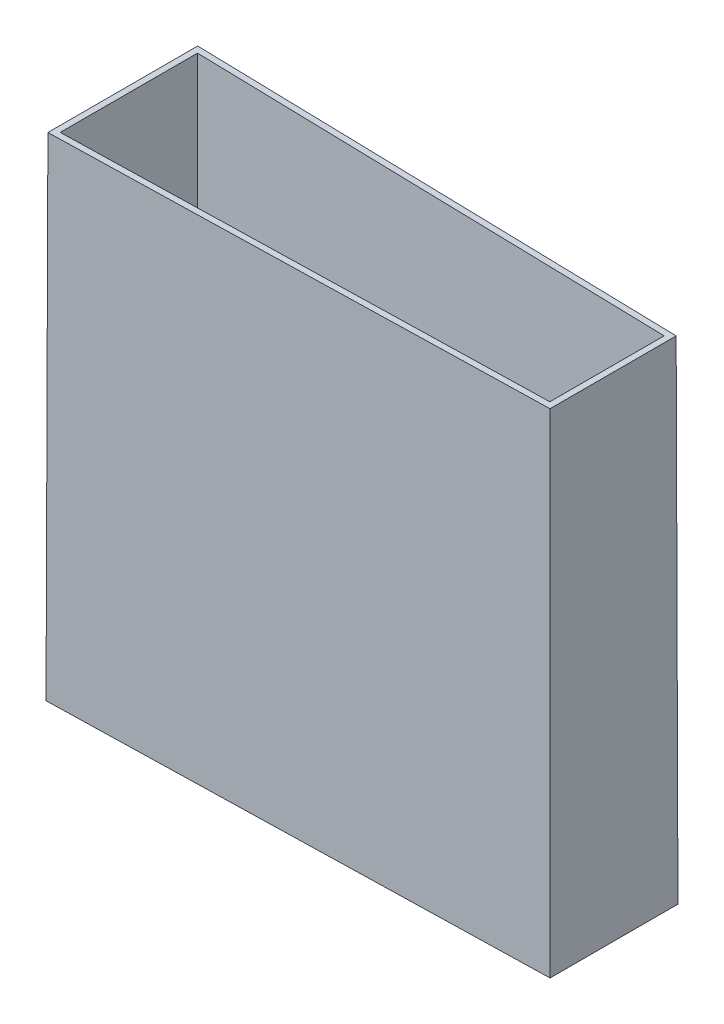
ISO-10303-21;
HEADER;
FILE_DESCRIPTION(('STEP AP214'),'2;1');
FILE_NAME('part.step','',(''),(''),'','','');
FILE_SCHEMA(('AUTOMOTIVE_DESIGN { 1 0 10303 214 1 1 1 1 }'));
ENDSEC;
DATA;
#1=APPLICATION_CONTEXT('core data for automotive mechanical design processes');
#2=APPLICATION_PROTOCOL_DEFINITION('international standard','automotive_design',2000,#1);
#3=PRODUCT_CONTEXT('',#1,'mechanical');
#4=PRODUCT('Part','Part','',(#3));
#5=PRODUCT_RELATED_PRODUCT_CATEGORY('part','',(#4));
#6=PRODUCT_DEFINITION_FORMATION('','',#4);
#7=PRODUCT_DEFINITION_CONTEXT('part definition',#1,'design');
#8=PRODUCT_DEFINITION('design','',#6,#7);
#9=PRODUCT_DEFINITION_SHAPE('','',#8);
#10=(LENGTH_UNIT() NAMED_UNIT(*) SI_UNIT(.MILLI.,.METRE.));
#11=(NAMED_UNIT(*) PLANE_ANGLE_UNIT() SI_UNIT($,.RADIAN.));
#12=(NAMED_UNIT(*) SI_UNIT($,.STERADIAN.) SOLID_ANGLE_UNIT());
#13=UNCERTAINTY_MEASURE_WITH_UNIT(LENGTH_MEASURE(1.E-05),#10,'distance_accuracy_value','');
#14=(GEOMETRIC_REPRESENTATION_CONTEXT(3) GLOBAL_UNCERTAINTY_ASSIGNED_CONTEXT((#13)) GLOBAL_UNIT_ASSIGNED_CONTEXT((#10,
#11,#12)) REPRESENTATION_CONTEXT('',''));
#15=CARTESIAN_POINT('',(0.,0.,0.));
#16=DIRECTION('',(0.,0.,1.));
#17=DIRECTION('',(1.,0.,0.));
#18=AXIS2_PLACEMENT_3D('',#15,#16,#17);
#19=CARTESIAN_POINT('',(0.,80.8,0.));
#20=DIRECTION('',(0.,1.,0.));
#21=DIRECTION('',(0.,0.,1.));
#22=AXIS2_PLACEMENT_3D('',#19,#20,#21);
#23=PLANE('',#22);
#24=DIRECTION('',(0.99970786139218,0.,-0.0241700614536627));
#25=VECTOR('',#24,1.);
#26=CARTESIAN_POINT('',(-7.4983383967968,80.8,14.0997284287893));
#27=LINE('',#26,#25);
#28=CARTESIAN_POINT('',(-7.4983383967968,80.8,14.0997284287893));
#29=VERTEX_POINT('',#28);
#30=CARTESIAN_POINT('',(73.0016616032032,80.8,12.1534699045137));
#31=VERTEX_POINT('',#30);
#32=EDGE_CURVE('E284',#29,#31,#27,.T.);
#33=ORIENTED_EDGE('',*,*,#32,.T.);
#34=DIRECTION('',(0.,0.,-1.));
#35=VECTOR('',#34,1.);
#36=CARTESIAN_POINT('',(73.0016616032032,80.8,12.1534699045137));
#37=LINE('',#36,#35);
#38=CARTESIAN_POINT('',(73.0016616032032,80.8,-8.55368284187437));
#39=VERTEX_POINT('',#38);
#40=EDGE_CURVE('E282',#31,#39,#37,.T.);
#41=ORIENTED_EDGE('',*,*,#40,.T.);
#42=DIRECTION('',(-0.999709957314757,0.,-0.0240832150205744));
#43=VECTOR('',#42,1.);
#44=CARTESIAN_POINT('',(73.0016616032032,80.8,-8.55368284187437));
#45=LINE('',#44,#43);
#46=CARTESIAN_POINT('',(-7.4983383967968,80.8,-10.492944119579));
#47=VERTEX_POINT('',#46);
#48=EDGE_CURVE('E58',#39,#47,#45,.T.);
#49=ORIENTED_EDGE('',*,*,#48,.T.);
#50=DIRECTION('',(0.,0.,1.));
#51=VECTOR('',#50,1.);
#52=CARTESIAN_POINT('',(-7.4983383967968,80.8,-10.492944119579));
#53=LINE('',#52,#51);
#54=EDGE_CURVE('E12',#47,#29,#53,.T.);
#55=ORIENTED_EDGE('',*,*,#54,.T.);
#56=EDGE_LOOP('',(#33,#41,#49,#55));
#57=FACE_BOUND('',#56,.T.);
#58=DIRECTION('',(0.,0.,1.));
#59=VECTOR('',#58,1.);
#60=CARTESIAN_POINT('',(-6.4983383967968,80.8,-9.46856379053706));
#61=LINE('',#60,#59);
#62=CARTESIAN_POINT('',(-6.4983383967968,80.8,-9.46856379053706));
#63=VERTEX_POINT('',#62);
#64=CARTESIAN_POINT('',(-6.4983383967968,80.8,13.0752590802864));
#65=VERTEX_POINT('',#64);
#66=EDGE_CURVE('E264',#63,#65,#61,.T.);
#67=ORIENTED_EDGE('',*,*,#66,.F.);
#68=DIRECTION('',(-0.999709957314757,0.,-0.0240832150205743));
#69=VECTOR('',#68,1.);
#70=CARTESIAN_POINT('',(72.0016616032032,80.8,-7.57748291724747));
#71=LINE('',#70,#69);
#72=CARTESIAN_POINT('',(72.0016616032032,80.8,-7.57748291724747));
#73=VERTEX_POINT('',#72);
#74=EDGE_CURVE('E382',#73,#63,#71,.T.);
#75=ORIENTED_EDGE('',*,*,#74,.F.);
#76=DIRECTION('',(0.,0.,-1.));
#77=VECTOR('',#76,1.);
#78=CARTESIAN_POINT('',(72.0016616032032,80.8,11.1773548050611));
#79=LINE('',#78,#77);
#80=CARTESIAN_POINT('',(72.0016616032032,80.8,11.1773548050611));
#81=VERTEX_POINT('',#80);
#82=EDGE_CURVE('E125',#81,#73,#79,.T.);
#83=ORIENTED_EDGE('',*,*,#82,.F.);
#84=DIRECTION('',(0.99970786139218,0.,-0.0241700614536627));
#85=VECTOR('',#84,1.);
#86=CARTESIAN_POINT('',(-6.4983383967968,80.8,13.0752590802864));
#87=LINE('',#86,#85);
#88=EDGE_CURVE('E185',#65,#81,#87,.T.);
#89=ORIENTED_EDGE('',*,*,#88,.F.);
#90=EDGE_LOOP('',(#67,#75,#83,#89));
#91=FACE_BOUND('',#90,.T.);
#92=ADVANCED_FACE('F49',(#57,#91),#23,.T.);
#93=CARTESIAN_POINT('',(0.,0.,0.));
#94=DIRECTION('',(0.,1.,0.));
#95=DIRECTION('',(0.,0.,1.));
#96=AXIS2_PLACEMENT_3D('',#93,#94,#95);
#97=PLANE('',#96);
#98=DIRECTION('',(-0.999709957314757,0.,-0.0240832150205743));
#99=VECTOR('',#98,1.);
#100=CARTESIAN_POINT('',(73.1516616032032,0.,-8.7001128305684));
#101=LINE('',#100,#99);
#102=CARTESIAN_POINT('',(73.1516616032032,0.,-8.7001128305684));
#103=VERTEX_POINT('',#102);
#104=CARTESIAN_POINT('',(-7.6483383967968,0.,-10.6466011689353));
#105=VERTEX_POINT('',#104);
#106=EDGE_CURVE('E246',#103,#105,#101,.T.);
#107=ORIENTED_EDGE('',*,*,#106,.F.);
#108=DIRECTION('',(0.,0.,-1.));
#109=VECTOR('',#108,1.);
#110=CARTESIAN_POINT('',(73.1516616032032,0.,12.2998871694316));
#111=LINE('',#110,#109);
#112=CARTESIAN_POINT('',(73.1516616032032,0.,12.2998871694316));
#113=VERTEX_POINT('',#112);
#114=EDGE_CURVE('E250',#113,#103,#111,.T.);
#115=ORIENTED_EDGE('',*,*,#114,.F.);
#116=DIRECTION('',(0.99970786139218,0.,-0.0241700614536627));
#117=VECTOR('',#116,1.);
#118=CARTESIAN_POINT('',(-7.6483383967968,0.,14.2533988310647));
#119=LINE('',#118,#117);
#120=CARTESIAN_POINT('',(-7.6483383967968,0.,14.2533988310647));
#121=VERTEX_POINT('',#120);
#122=EDGE_CURVE('E245',#121,#113,#119,.T.);
#123=ORIENTED_EDGE('',*,*,#122,.F.);
#124=DIRECTION('',(0.,0.,1.));
#125=VECTOR('',#124,1.);
#126=CARTESIAN_POINT('',(-7.6483383967968,0.,-10.6466011689353));
#127=LINE('',#126,#125);
#128=EDGE_CURVE('E237',#105,#121,#127,.T.);
#129=ORIENTED_EDGE('',*,*,#128,.F.);
#130=EDGE_LOOP('',(#107,#115,#123,#129));
#131=FACE_BOUND('',#130,.T.);
#132=ADVANCED_FACE('F209',(#131),#97,.F.);
#133=CARTESIAN_POINT('',(0.251893103062866,0.0194169812665976,-10.4562469377834));
#134=DIRECTION('',(-0.0240831735210479,-0.00185643244460607,0.999708234642355));
#135=DIRECTION('',(0.999709957314757,0.,0.0240832150205744));
#136=AXIS2_PLACEMENT_3D('',#133,#134,#135);
#137=PLANE('',#136);
#138=DIRECTION('',(0.0018564290877808,0.999996468617923,0.00190168943978388));
#139=VECTOR('',#138,1.);
#140=CARTESIAN_POINT('',(-7.6483383967968,0.,-10.6466011689353));
#141=LINE('',#140,#139);
#142=EDGE_CURVE('E255',#105,#47,#141,.T.);
#143=ORIENTED_EDGE('',*,*,#142,.T.);
#144=ORIENTED_EDGE('',*,*,#48,.F.);
#145=DIRECTION('',(-0.00185642939612201,0.999996634711075,0.0018122462365695));
#146=VECTOR('',#145,1.);
#147=CARTESIAN_POINT('',(73.1516616032032,0.,-8.7001128305684));
#148=LINE('',#147,#146);
#149=EDGE_CURVE('E287',#103,#39,#148,.T.);
#150=ORIENTED_EDGE('',*,*,#149,.F.);
#151=ORIENTED_EDGE('',*,*,#106,.T.);
#152=EDGE_LOOP('',(#143,#144,#150,#151));
#153=FACE_BOUND('',#152,.T.);
#154=ADVANCED_FACE('F213',(#153),#137,.F.);
#155=CARTESIAN_POINT('',(73.1514094976018,0.135800883968318,0.));
#156=DIRECTION('',(-0.999998276827805,-0.00185643244460604,0.));
#157=DIRECTION('',(0.00185643244460604,-0.999998276827805,0.));
#158=AXIS2_PLACEMENT_3D('',#155,#156,#157);
#159=PLANE('',#158);
#160=ORIENTED_EDGE('',*,*,#149,.T.);
#161=ORIENTED_EDGE('',*,*,#40,.F.);
#162=DIRECTION('',(-0.00185642939665177,0.99999663499644,-0.00181208876513943));
#163=VECTOR('',#162,1.);
#164=CARTESIAN_POINT('',(73.1516616032032,0.,12.2998871694316));
#165=LINE('',#164,#163);
#166=EDGE_CURVE('E275',#113,#31,#165,.T.);
#167=ORIENTED_EDGE('',*,*,#166,.F.);
#168=ORIENTED_EDGE('',*,*,#114,.T.);
#169=EDGE_LOOP('',(#160,#161,#167,#168));
#170=FACE_BOUND('',#169,.T.);
#171=ADVANCED_FACE('F280',(#170),#159,.F.);
#172=CARTESIAN_POINT('',(-7.64831203801138,0.0141985990804667,0.));
#173=DIRECTION('',(0.999998276827805,-0.00185643244460607,0.));
#174=DIRECTION('',(0.00185643244460607,0.999998276827805,0.));
#175=AXIS2_PLACEMENT_3D('',#172,#173,#174);
#176=PLANE('',#175);
#177=DIRECTION('',(0.00185642908719735,0.99999646830364,-0.00190185469750288));
#178=VECTOR('',#177,1.);
#179=CARTESIAN_POINT('',(-7.6483383967968,0.,14.2533988310647));
#180=LINE('',#179,#178);
#181=EDGE_CURVE('E277',#121,#29,#180,.T.);
#182=ORIENTED_EDGE('',*,*,#181,.T.);
#183=ORIENTED_EDGE('',*,*,#54,.F.);
#184=ORIENTED_EDGE('',*,*,#142,.F.);
#185=ORIENTED_EDGE('',*,*,#128,.T.);
#186=EDGE_LOOP('',(#182,#183,#184,#185));
#187=FACE_BOUND('',#186,.T.);
#188=ADVANCED_FACE('F317',(#187),#176,.F.);
#189=CARTESIAN_POINT('',(0.339935613651948,0.0261095153154757,14.0602168507738));
#190=DIRECTION('',(-0.0241700198044848,-0.00185643244460606,-0.99970613872339));
#191=DIRECTION('',(-0.99970786139218,0.,0.0241700614536627));
#192=AXIS2_PLACEMENT_3D('',#189,#190,#191);
#193=PLANE('',#192);
#194=ORIENTED_EDGE('',*,*,#166,.T.);
#195=ORIENTED_EDGE('',*,*,#32,.F.);
#196=ORIENTED_EDGE('',*,*,#181,.F.);
#197=ORIENTED_EDGE('',*,*,#122,.T.);
#198=EDGE_LOOP('',(#194,#195,#196,#197));
#199=FACE_BOUND('',#198,.T.);
#200=ADVANCED_FACE('F274',(#199),#193,.F.);
#201=CARTESIAN_POINT('',(0.,1.,0.));
#202=DIRECTION('',(0.,-1.,0.));
#203=DIRECTION('',(0.,0.,-1.));
#204=AXIS2_PLACEMENT_3D('',#201,#202,#203);
#205=PLANE('',#204);
#206=DIRECTION('',(-0.99970786139218,0.,0.0241700614536627));
#207=VECTOR('',#206,1.);
#208=CARTESIAN_POINT('',(72.1516616032032,1.,11.323772069979));
#209=LINE('',#208,#207);
#210=CARTESIAN_POINT('',(72.1516616032032,1.,11.323772069979));
#211=VERTEX_POINT('',#210);
#212=CARTESIAN_POINT('',(-6.6483383967968,1.,13.2289294825618));
#213=VERTEX_POINT('',#212);
#214=EDGE_CURVE('E138',#211,#213,#209,.T.);
#215=ORIENTED_EDGE('',*,*,#214,.F.);
#216=DIRECTION('',(0.,0.,1.));
#217=VECTOR('',#216,1.);
#218=CARTESIAN_POINT('',(72.1516616032032,1.,-7.7239129059415));
#219=LINE('',#218,#217);
#220=CARTESIAN_POINT('',(72.1516616032032,1.,-7.7239129059415));
#221=VERTEX_POINT('',#220);
#222=EDGE_CURVE('E121',#221,#211,#219,.T.);
#223=ORIENTED_EDGE('',*,*,#222,.F.);
#224=DIRECTION('',(0.999709957314757,0.,0.0240832150205743));
#225=VECTOR('',#224,1.);
#226=CARTESIAN_POINT('',(-6.6483383967968,1.,-9.62222083989334));
#227=LINE('',#226,#225);
#228=CARTESIAN_POINT('',(-6.6483383967968,1.,-9.62222083989334));
#229=VERTEX_POINT('',#228);
#230=EDGE_CURVE('E135',#229,#221,#227,.T.);
#231=ORIENTED_EDGE('',*,*,#230,.F.);
#232=DIRECTION('',(0.,0.,-1.));
#233=VECTOR('',#232,1.);
#234=CARTESIAN_POINT('',(-6.6483383967968,1.,13.2289294825618));
#235=LINE('',#234,#233);
#236=EDGE_CURVE('E147',#213,#229,#235,.T.);
#237=ORIENTED_EDGE('',*,*,#236,.F.);
#238=EDGE_LOOP('',(#215,#223,#231,#237));
#239=FACE_BOUND('',#238,.T.);
#240=ADVANCED_FACE('F134',(#239),#205,.F.);
#241=CARTESIAN_POINT('',(0.227855220282238,0.0177841407751793,-9.45841875130458));
#242=DIRECTION('',(-0.0240831724744454,-0.00187969592738731,0.999708191197205));
#243=DIRECTION('',(0.999709957314757,0.,0.0240832150205743));
#244=AXIS2_PLACEMENT_3D('',#241,#242,#243);
#245=PLANE('',#244);
#246=DIRECTION('',(0.00187969244277828,0.999996379558043,0.00192551996303082));
#247=VECTOR('',#246,1.);
#248=CARTESIAN_POINT('',(-6.6483383967968,1.,-9.62222083989334));
#249=LINE('',#248,#247);
#250=EDGE_CURVE('E130',#229,#63,#249,.T.);
#251=ORIENTED_EDGE('',*,*,#250,.F.);
#252=ORIENTED_EDGE('',*,*,#230,.T.);
#253=DIRECTION('',(-0.00187969276285705,0.999996549839968,0.00183495593342281));
#254=VECTOR('',#253,1.);
#255=CARTESIAN_POINT('',(72.1516616032032,1.,-7.7239129059415));
#256=LINE('',#255,#254);
#257=EDGE_CURVE('E118',#221,#73,#256,.T.);
#258=ORIENTED_EDGE('',*,*,#257,.T.);
#259=ORIENTED_EDGE('',*,*,#74,.T.);
#260=EDGE_LOOP('',(#251,#252,#258,#259));
#261=FACE_BOUND('',#260,.T.);
#262=ADVANCED_FACE('F145',(#261),#245,.T.);
#263=CARTESIAN_POINT('',(72.1532863654623,0.135626478130566,0.));
#264=DIRECTION('',(-0.99999823337005,-0.00187969592738728,0.));
#265=DIRECTION('',(0.00187969592738728,-0.99999823337005,0.));
#266=AXIS2_PLACEMENT_3D('',#263,#264,#265);
#267=PLANE('',#266);
#268=ORIENTED_EDGE('',*,*,#257,.F.);
#269=ORIENTED_EDGE('',*,*,#222,.T.);
#270=DIRECTION('',(-0.00187969276340698,0.999996550132529,-0.00183479648869329));
#271=VECTOR('',#270,1.);
#272=CARTESIAN_POINT('',(72.1516616032032,1.,11.323772069979));
#273=LINE('',#272,#271);
#274=EDGE_CURVE('E184',#211,#81,#273,.T.);
#275=ORIENTED_EDGE('',*,*,#274,.T.);
#276=ORIENTED_EDGE('',*,*,#82,.T.);
#277=EDGE_LOOP('',(#268,#269,#275,#276));
#278=FACE_BOUND('',#277,.T.);
#279=ADVANCED_FACE('F120',(#278),#267,.T.);
#280=CARTESIAN_POINT('',(-6.65019459911675,0.0125003657878134,0.));
#281=DIRECTION('',(0.99999823337005,-0.00187969592738731,0.));
#282=DIRECTION('',(0.00187969592738731,0.99999823337005,0.));
#283=AXIS2_PLACEMENT_3D('',#280,#281,#282);
#284=PLANE('',#283);
#285=DIRECTION('',(0.00187969244217262,0.999996379235834,-0.00192568729161839));
#286=VECTOR('',#285,1.);
#287=CARTESIAN_POINT('',(-6.6483383967968,1.,13.2289294825618));
#288=LINE('',#287,#286);
#289=EDGE_CURVE('E66',#213,#65,#288,.T.);
#290=ORIENTED_EDGE('',*,*,#289,.F.);
#291=ORIENTED_EDGE('',*,*,#236,.T.);
#292=ORIENTED_EDGE('',*,*,#250,.T.);
#293=ORIENTED_EDGE('',*,*,#66,.T.);
#294=EDGE_LOOP('',(#290,#291,#292,#293));
#295=FACE_BOUND('',#294,.T.);
#296=ADVANCED_FACE('F171',(#295),#284,.T.);
#297=CARTESIAN_POINT('',(0.315811040337409,0.0245605405765469,13.0623904430291));
#298=DIRECTION('',(-0.0241700187541082,-0.0018796959273873,-0.999706095278331));
#299=DIRECTION('',(-0.99970786139218,0.,0.0241700614536627));
#300=AXIS2_PLACEMENT_3D('',#297,#298,#299);
#301=PLANE('',#300);
#302=ORIENTED_EDGE('',*,*,#274,.F.);
#303=ORIENTED_EDGE('',*,*,#214,.T.);
#304=ORIENTED_EDGE('',*,*,#289,.T.);
#305=ORIENTED_EDGE('',*,*,#88,.T.);
#306=EDGE_LOOP('',(#302,#303,#304,#305));
#307=FACE_BOUND('',#306,.T.);
#308=ADVANCED_FACE('F200',(#307),#301,.T.);
#309=CLOSED_SHELL('',(#92,#132,#154,#171,#188,#200,#240,#262,#279,#296,#308));
#310=MANIFOLD_SOLID_BREP('B2',#309);
#311=ADVANCED_BREP_SHAPE_REPRESENTATION('',(#18,#310),#14);
#312=SHAPE_DEFINITION_REPRESENTATION(#9,#311);
ENDSEC;
END-ISO-10303-21;
